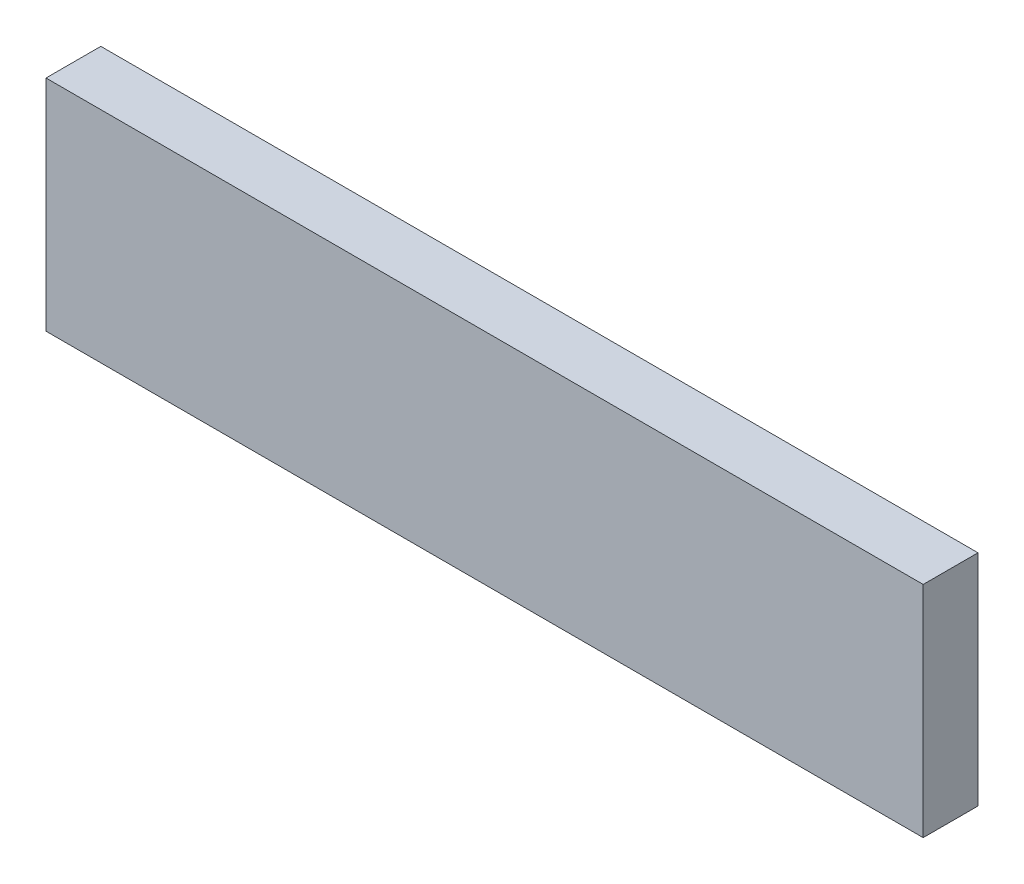
ISO-10303-21;
HEADER;
FILE_DESCRIPTION(('STEP AP214'),'2;1');
FILE_NAME('part.step','',(''),(''),'','','');
FILE_SCHEMA(('AUTOMOTIVE_DESIGN { 1 0 10303 214 1 1 1 1 }'));
ENDSEC;
DATA;
#1=APPLICATION_CONTEXT('core data for automotive mechanical design processes');
#2=APPLICATION_PROTOCOL_DEFINITION('international standard','automotive_design',2000,#1);
#3=PRODUCT_CONTEXT('',#1,'mechanical');
#4=PRODUCT('Part','Part','',(#3));
#5=PRODUCT_RELATED_PRODUCT_CATEGORY('part','',(#4));
#6=PRODUCT_DEFINITION_FORMATION('','',#4);
#7=PRODUCT_DEFINITION_CONTEXT('part definition',#1,'design');
#8=PRODUCT_DEFINITION('design','',#6,#7);
#9=PRODUCT_DEFINITION_SHAPE('','',#8);
#10=(LENGTH_UNIT() NAMED_UNIT(*) SI_UNIT(.MILLI.,.METRE.));
#11=(NAMED_UNIT(*) PLANE_ANGLE_UNIT() SI_UNIT($,.RADIAN.));
#12=(NAMED_UNIT(*) SI_UNIT($,.STERADIAN.) SOLID_ANGLE_UNIT());
#13=UNCERTAINTY_MEASURE_WITH_UNIT(LENGTH_MEASURE(1.E-05),#10,'distance_accuracy_value','');
#14=(GEOMETRIC_REPRESENTATION_CONTEXT(3) GLOBAL_UNCERTAINTY_ASSIGNED_CONTEXT((#13)) GLOBAL_UNIT_ASSIGNED_CONTEXT((#10,
#11,#12)) REPRESENTATION_CONTEXT('',''));
#15=CARTESIAN_POINT('',(0.,0.,0.));
#16=DIRECTION('',(0.,0.,1.));
#17=DIRECTION('',(1.,0.,0.));
#18=AXIS2_PLACEMENT_3D('',#15,#16,#17);
#19=CARTESIAN_POINT('',(50.8,-12.7,6.35));
#20=DIRECTION('',(-1.,0.,0.));
#21=DIRECTION('',(0.,0.,1.));
#22=AXIS2_PLACEMENT_3D('',#19,#20,#21);
#23=PLANE('',#22);
#24=DIRECTION('',(0.,1.,0.));
#25=VECTOR('',#24,1.);
#26=CARTESIAN_POINT('',(50.8,-12.7,0.));
#27=LINE('',#26,#25);
#28=CARTESIAN_POINT('',(50.8,-12.7,0.));
#29=VERTEX_POINT('',#28);
#30=CARTESIAN_POINT('',(50.8,12.7,0.));
#31=VERTEX_POINT('',#30);
#32=EDGE_CURVE('E107',#29,#31,#27,.T.);
#33=ORIENTED_EDGE('',*,*,#32,.T.);
#34=DIRECTION('',(0.,0.,-1.));
#35=VECTOR('',#34,1.);
#36=CARTESIAN_POINT('',(50.8,12.7,6.35));
#37=LINE('',#36,#35);
#38=CARTESIAN_POINT('',(50.8,12.7,6.35));
#39=VERTEX_POINT('',#38);
#40=EDGE_CURVE('E11',#39,#31,#37,.T.);
#41=ORIENTED_EDGE('',*,*,#40,.F.);
#42=DIRECTION('',(0.,1.,0.));
#43=VECTOR('',#42,1.);
#44=CARTESIAN_POINT('',(50.8,-12.7,6.35));
#45=LINE('',#44,#43);
#46=CARTESIAN_POINT('',(50.8,-12.7,6.35));
#47=VERTEX_POINT('',#46);
#48=EDGE_CURVE('E91',#47,#39,#45,.T.);
#49=ORIENTED_EDGE('',*,*,#48,.F.);
#50=DIRECTION('',(0.,0.,-1.));
#51=VECTOR('',#50,1.);
#52=CARTESIAN_POINT('',(50.8,-12.7,6.35));
#53=LINE('',#52,#51);
#54=EDGE_CURVE('E103',#47,#29,#53,.T.);
#55=ORIENTED_EDGE('',*,*,#54,.T.);
#56=EDGE_LOOP('',(#33,#41,#49,#55));
#57=FACE_BOUND('',#56,.T.);
#58=ADVANCED_FACE('F39',(#57),#23,.F.);
#59=CARTESIAN_POINT('',(-50.8,12.7,6.35));
#60=DIRECTION('',(0.,-1.,0.));
#61=DIRECTION('',(0.,0.,-1.));
#62=AXIS2_PLACEMENT_3D('',#59,#60,#61);
#63=PLANE('',#62);
#64=DIRECTION('',(-1.,0.,0.));
#65=VECTOR('',#64,1.);
#66=CARTESIAN_POINT('',(-50.8,12.7,0.));
#67=LINE('',#66,#65);
#68=CARTESIAN_POINT('',(-50.8,12.7,0.));
#69=VERTEX_POINT('',#68);
#70=EDGE_CURVE('E96',#31,#69,#67,.T.);
#71=ORIENTED_EDGE('',*,*,#70,.T.);
#72=DIRECTION('',(0.,0.,-1.));
#73=VECTOR('',#72,1.);
#74=CARTESIAN_POINT('',(-50.8,12.7,6.35));
#75=LINE('',#74,#73);
#76=CARTESIAN_POINT('',(-50.8,12.7,6.35));
#77=VERTEX_POINT('',#76);
#78=EDGE_CURVE('E48',#77,#69,#75,.T.);
#79=ORIENTED_EDGE('',*,*,#78,.F.);
#80=DIRECTION('',(-1.,0.,0.));
#81=VECTOR('',#80,1.);
#82=CARTESIAN_POINT('',(-50.8,12.7,6.35));
#83=LINE('',#82,#81);
#84=EDGE_CURVE('E86',#39,#77,#83,.T.);
#85=ORIENTED_EDGE('',*,*,#84,.F.);
#86=ORIENTED_EDGE('',*,*,#40,.T.);
#87=EDGE_LOOP('',(#71,#79,#85,#86));
#88=FACE_BOUND('',#87,.T.);
#89=ADVANCED_FACE('F95',(#88),#63,.F.);
#90=CARTESIAN_POINT('',(-50.8,-12.7,6.35));
#91=DIRECTION('',(1.,0.,0.));
#92=DIRECTION('',(0.,0.,-1.));
#93=AXIS2_PLACEMENT_3D('',#90,#91,#92);
#94=PLANE('',#93);
#95=DIRECTION('',(0.,-1.,0.));
#96=VECTOR('',#95,1.);
#97=CARTESIAN_POINT('',(-50.8,-12.7,0.));
#98=LINE('',#97,#96);
#99=CARTESIAN_POINT('',(-50.8,-12.7,0.));
#100=VERTEX_POINT('',#99);
#101=EDGE_CURVE('E73',#69,#100,#98,.T.);
#102=ORIENTED_EDGE('',*,*,#101,.T.);
#103=DIRECTION('',(0.,0.,-1.));
#104=VECTOR('',#103,1.);
#105=CARTESIAN_POINT('',(-50.8,-12.7,6.35));
#106=LINE('',#105,#104);
#107=CARTESIAN_POINT('',(-50.8,-12.7,6.35));
#108=VERTEX_POINT('',#107);
#109=EDGE_CURVE('E98',#108,#100,#106,.T.);
#110=ORIENTED_EDGE('',*,*,#109,.F.);
#111=DIRECTION('',(0.,-1.,0.));
#112=VECTOR('',#111,1.);
#113=CARTESIAN_POINT('',(-50.8,-12.7,6.35));
#114=LINE('',#113,#112);
#115=EDGE_CURVE('E89',#77,#108,#114,.T.);
#116=ORIENTED_EDGE('',*,*,#115,.F.);
#117=ORIENTED_EDGE('',*,*,#78,.T.);
#118=EDGE_LOOP('',(#102,#110,#116,#117));
#119=FACE_BOUND('',#118,.T.);
#120=ADVANCED_FACE('F99',(#119),#94,.F.);
#121=CARTESIAN_POINT('',(-50.8,-12.7,6.35));
#122=DIRECTION('',(0.,1.,0.));
#123=DIRECTION('',(0.,0.,1.));
#124=AXIS2_PLACEMENT_3D('',#121,#122,#123);
#125=PLANE('',#124);
#126=DIRECTION('',(1.,0.,0.));
#127=VECTOR('',#126,1.);
#128=CARTESIAN_POINT('',(-50.8,-12.7,0.));
#129=LINE('',#128,#127);
#130=EDGE_CURVE('E79',#100,#29,#129,.T.);
#131=ORIENTED_EDGE('',*,*,#130,.T.);
#132=ORIENTED_EDGE('',*,*,#54,.F.);
#133=DIRECTION('',(1.,0.,0.));
#134=VECTOR('',#133,1.);
#135=CARTESIAN_POINT('',(-50.8,-12.7,6.35));
#136=LINE('',#135,#134);
#137=EDGE_CURVE('E56',#108,#47,#136,.T.);
#138=ORIENTED_EDGE('',*,*,#137,.F.);
#139=ORIENTED_EDGE('',*,*,#109,.T.);
#140=EDGE_LOOP('',(#131,#132,#138,#139));
#141=FACE_BOUND('',#140,.T.);
#142=ADVANCED_FACE('F120',(#141),#125,.F.);
#143=CARTESIAN_POINT('',(0.,0.,6.35));
#144=DIRECTION('',(0.,0.,-1.));
#145=DIRECTION('',(-1.,0.,0.));
#146=AXIS2_PLACEMENT_3D('',#143,#144,#145);
#147=PLANE('',#146);
#148=ORIENTED_EDGE('',*,*,#48,.T.);
#149=ORIENTED_EDGE('',*,*,#84,.T.);
#150=ORIENTED_EDGE('',*,*,#115,.T.);
#151=ORIENTED_EDGE('',*,*,#137,.T.);
#152=EDGE_LOOP('',(#148,#149,#150,#151));
#153=FACE_BOUND('',#152,.T.);
#154=ADVANCED_FACE('F87',(#153),#147,.F.);
#155=CARTESIAN_POINT('',(0.,0.,0.));
#156=DIRECTION('',(0.,0.,-1.));
#157=DIRECTION('',(-1.,0.,0.));
#158=AXIS2_PLACEMENT_3D('',#155,#156,#157);
#159=PLANE('',#158);
#160=ORIENTED_EDGE('',*,*,#32,.F.);
#161=ORIENTED_EDGE('',*,*,#130,.F.);
#162=ORIENTED_EDGE('',*,*,#101,.F.);
#163=ORIENTED_EDGE('',*,*,#70,.F.);
#164=EDGE_LOOP('',(#160,#161,#162,#163));
#165=FACE_BOUND('',#164,.T.);
#166=ADVANCED_FACE('F123',(#165),#159,.T.);
#167=CLOSED_SHELL('',(#58,#89,#120,#142,#154,#166));
#168=MANIFOLD_SOLID_BREP('B2',#167);
#169=ADVANCED_BREP_SHAPE_REPRESENTATION('',(#18,#168),#14);
#170=SHAPE_DEFINITION_REPRESENTATION(#9,#169);
ENDSEC;
END-ISO-10303-21;
